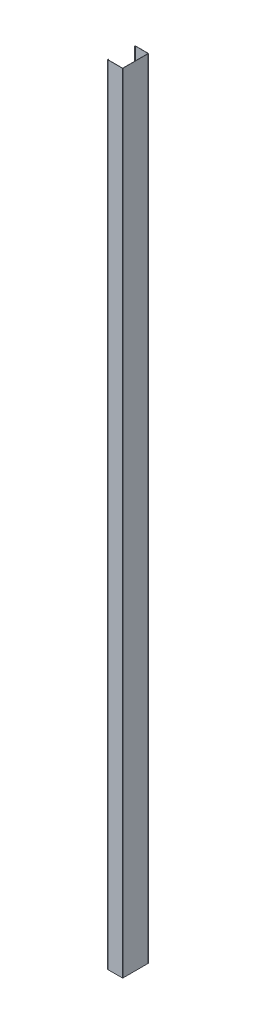
ISO-10303-21;
HEADER;
FILE_DESCRIPTION(('STEP AP214'),'2;1');
FILE_NAME('part.step','',(''),(''),'','','');
FILE_SCHEMA(('AUTOMOTIVE_DESIGN { 1 0 10303 214 1 1 1 1 }'));
ENDSEC;
DATA;
#1=APPLICATION_CONTEXT('core data for automotive mechanical design processes');
#2=APPLICATION_PROTOCOL_DEFINITION('international standard','automotive_design',2000,#1);
#3=PRODUCT_CONTEXT('',#1,'mechanical');
#4=PRODUCT('Part','Part','',(#3));
#5=PRODUCT_RELATED_PRODUCT_CATEGORY('part','',(#4));
#6=PRODUCT_DEFINITION_FORMATION('','',#4);
#7=PRODUCT_DEFINITION_CONTEXT('part definition',#1,'design');
#8=PRODUCT_DEFINITION('design','',#6,#7);
#9=PRODUCT_DEFINITION_SHAPE('','',#8);
#10=(LENGTH_UNIT() NAMED_UNIT(*) SI_UNIT(.MILLI.,.METRE.));
#11=(NAMED_UNIT(*) PLANE_ANGLE_UNIT() SI_UNIT($,.RADIAN.));
#12=(NAMED_UNIT(*) SI_UNIT($,.STERADIAN.) SOLID_ANGLE_UNIT());
#13=UNCERTAINTY_MEASURE_WITH_UNIT(LENGTH_MEASURE(1.E-05),#10,'distance_accuracy_value','');
#14=(GEOMETRIC_REPRESENTATION_CONTEXT(3) GLOBAL_UNCERTAINTY_ASSIGNED_CONTEXT((#13)) GLOBAL_UNIT_ASSIGNED_CONTEXT((#10,
#11,#12)) REPRESENTATION_CONTEXT('',''));
#15=CARTESIAN_POINT('',(0.,0.,0.));
#16=DIRECTION('',(0.,0.,1.));
#17=DIRECTION('',(1.,0.,0.));
#18=AXIS2_PLACEMENT_3D('',#15,#16,#17);
#19=CARTESIAN_POINT('',(-57.8111716302014,3000.,97.));
#20=DIRECTION('',(0.,1.,0.));
#21=DIRECTION('',(0.,0.,1.));
#22=AXIS2_PLACEMENT_3D('',#19,#20,#21);
#23=PLANE('',#22);
#24=DIRECTION('',(1.,0.,0.));
#25=VECTOR('',#24,1.);
#26=CARTESIAN_POINT('',(-57.8111716302014,3000.,97.));
#27=LINE('',#26,#25);
#28=CARTESIAN_POINT('',(-57.8111716302014,3000.,97.));
#29=VERTEX_POINT('',#28);
#30=CARTESIAN_POINT('',(-57.0611716302014,3000.,97.));
#31=VERTEX_POINT('',#30);
#32=EDGE_CURVE('E11',#29,#31,#27,.T.);
#33=ORIENTED_EDGE('',*,*,#32,.F.);
#34=CARTESIAN_POINT('',(-56.3111716302014,3000.,97.));
#35=DIRECTION('',(0.,-1.,0.));
#36=DIRECTION('',(0.,0.,-1.));
#37=AXIS2_PLACEMENT_3D('',#34,#35,#36);
#38=CIRCLE('',#37,1.5);
#39=CARTESIAN_POINT('',(-56.3111716302014,3000.,98.5));
#40=VERTEX_POINT('',#39);
#41=EDGE_CURVE('E362',#29,#40,#38,.F.);
#42=ORIENTED_EDGE('',*,*,#41,.T.);
#43=DIRECTION('',(0.,0.,1.));
#44=VECTOR('',#43,1.);
#45=CARTESIAN_POINT('',(-56.3111716302014,3000.,97.75));
#46=LINE('',#45,#44);
#47=CARTESIAN_POINT('',(-56.3111716302014,3000.,97.75));
#48=VERTEX_POINT('',#47);
#49=EDGE_CURVE('E45',#48,#40,#46,.T.);
#50=ORIENTED_EDGE('',*,*,#49,.F.);
#51=CARTESIAN_POINT('',(-56.3111716302014,3000.,97.));
#52=DIRECTION('',(0.,1.,0.));
#53=DIRECTION('',(1.,0.,0.));
#54=AXIS2_PLACEMENT_3D('',#51,#52,#53);
#55=CIRCLE('',#54,0.75);
#56=EDGE_CURVE('E437',#31,#48,#55,.T.);
#57=ORIENTED_EDGE('',*,*,#56,.F.);
#58=EDGE_LOOP('',(#33,#42,#50,#57));
#59=FACE_BOUND('',#58,.T.);
#60=ADVANCED_FACE('F37',(#59),#23,.T.);
#61=CARTESIAN_POINT('',(-56.3111716302014,3000.,97.75));
#62=DIRECTION('',(0.,1.,0.));
#63=DIRECTION('',(0.,0.,1.));
#64=AXIS2_PLACEMENT_3D('',#61,#62,#63);
#65=PLANE('',#64);
#66=DIRECTION('',(0.,0.,1.));
#67=VECTOR('',#66,1.);
#68=CARTESIAN_POINT('',(-57.8111716302014,3000.,98.5));
#69=LINE('',#68,#67);
#70=CARTESIAN_POINT('',(-57.8111716302014,3000.,95.5));
#71=VERTEX_POINT('',#70);
#72=EDGE_CURVE('E366',#71,#29,#69,.T.);
#73=ORIENTED_EDGE('',*,*,#72,.T.);
#74=ORIENTED_EDGE('',*,*,#32,.T.);
#75=DIRECTION('',(0.,0.,-1.));
#76=VECTOR('',#75,1.);
#77=CARTESIAN_POINT('',(-57.0611716302014,3000.,98.5));
#78=LINE('',#77,#76);
#79=CARTESIAN_POINT('',(-57.0611716302014,3000.,95.5));
#80=VERTEX_POINT('',#79);
#81=EDGE_CURVE('E439',#80,#31,#78,.F.);
#82=ORIENTED_EDGE('',*,*,#81,.F.);
#83=DIRECTION('',(1.,0.,0.));
#84=VECTOR('',#83,1.);
#85=CARTESIAN_POINT('',(-57.8111716302014,3000.,95.5));
#86=LINE('',#85,#84);
#87=EDGE_CURVE('E442',#71,#80,#86,.T.);
#88=ORIENTED_EDGE('',*,*,#87,.F.);
#89=EDGE_LOOP('',(#73,#74,#82,#88));
#90=FACE_BOUND('',#89,.T.);
#91=ADVANCED_FACE('F448',(#90),#65,.T.);
#92=CARTESIAN_POINT('',(-56.3111716302014,0.,98.5));
#93=DIRECTION('',(0.,-1.,0.));
#94=DIRECTION('',(0.,0.,-1.));
#95=AXIS2_PLACEMENT_3D('',#92,#93,#94);
#96=PLANE('',#95);
#97=DIRECTION('',(0.,0.,-1.));
#98=VECTOR('',#97,1.);
#99=CARTESIAN_POINT('',(-56.3111716302014,0.,98.5));
#100=LINE('',#99,#98);
#101=CARTESIAN_POINT('',(-56.3111716302014,0.,98.5));
#102=VERTEX_POINT('',#101);
#103=CARTESIAN_POINT('',(-56.3111716302014,0.,97.75));
#104=VERTEX_POINT('',#103);
#105=EDGE_CURVE('E346',#102,#104,#100,.T.);
#106=ORIENTED_EDGE('',*,*,#105,.F.);
#107=CARTESIAN_POINT('',(-56.3111716302014,0.,97.));
#108=DIRECTION('',(0.,-1.,0.));
#109=DIRECTION('',(0.,0.,-1.));
#110=AXIS2_PLACEMENT_3D('',#107,#108,#109);
#111=CIRCLE('',#110,1.5);
#112=CARTESIAN_POINT('',(-57.8111716302014,0.,97.));
#113=VERTEX_POINT('',#112);
#114=EDGE_CURVE('E262',#113,#102,#111,.F.);
#115=ORIENTED_EDGE('',*,*,#114,.F.);
#116=DIRECTION('',(-1.,0.,0.));
#117=VECTOR('',#116,1.);
#118=CARTESIAN_POINT('',(-57.0611716302014,0.,97.));
#119=LINE('',#118,#117);
#120=CARTESIAN_POINT('',(-57.0611716302014,0.,97.));
#121=VERTEX_POINT('',#120);
#122=EDGE_CURVE('E344',#121,#113,#119,.T.);
#123=ORIENTED_EDGE('',*,*,#122,.F.);
#124=CARTESIAN_POINT('',(-56.3111716302014,0.,97.));
#125=DIRECTION('',(0.,1.,0.));
#126=DIRECTION('',(1.,0.,0.));
#127=AXIS2_PLACEMENT_3D('',#124,#125,#126);
#128=CIRCLE('',#127,0.75);
#129=EDGE_CURVE('E250',#121,#104,#128,.T.);
#130=ORIENTED_EDGE('',*,*,#129,.T.);
#131=EDGE_LOOP('',(#106,#115,#123,#130));
#132=FACE_BOUND('',#131,.T.);
#133=ADVANCED_FACE('F455',(#132),#96,.T.);
#134=CARTESIAN_POINT('',(-57.0611716302014,0.,97.));
#135=DIRECTION('',(0.,-1.,0.));
#136=DIRECTION('',(0.,0.,-1.));
#137=AXIS2_PLACEMENT_3D('',#134,#135,#136);
#138=PLANE('',#137);
#139=DIRECTION('',(1.,0.,0.));
#140=VECTOR('',#139,1.);
#141=CARTESIAN_POINT('',(0.,0.,98.5));
#142=LINE('',#141,#140);
#143=CARTESIAN_POINT('',(-1.49999999999999,0.,98.5));
#144=VERTEX_POINT('',#143);
#145=EDGE_CURVE('E265',#102,#144,#142,.T.);
#146=ORIENTED_EDGE('',*,*,#145,.F.);
#147=ORIENTED_EDGE('',*,*,#105,.T.);
#148=DIRECTION('',(1.,0.,0.));
#149=VECTOR('',#148,1.);
#150=CARTESIAN_POINT('',(0.,0.,97.75));
#151=LINE('',#150,#149);
#152=CARTESIAN_POINT('',(-1.49999999999999,0.,97.75));
#153=VERTEX_POINT('',#152);
#154=EDGE_CURVE('E247',#104,#153,#151,.T.);
#155=ORIENTED_EDGE('',*,*,#154,.T.);
#156=DIRECTION('',(0.,0.,1.));
#157=VECTOR('',#156,1.);
#158=CARTESIAN_POINT('',(-1.49999999999999,0.,97.75));
#159=LINE('',#158,#157);
#160=EDGE_CURVE('E336',#153,#144,#159,.T.);
#161=ORIENTED_EDGE('',*,*,#160,.T.);
#162=EDGE_LOOP('',(#146,#147,#155,#161));
#163=FACE_BOUND('',#162,.T.);
#164=ADVANCED_FACE('F458',(#163),#138,.T.);
#165=CARTESIAN_POINT('',(-1.49999999999999,3000.,98.5));
#166=DIRECTION('',(0.,1.,0.));
#167=DIRECTION('',(0.,0.,1.));
#168=AXIS2_PLACEMENT_3D('',#165,#166,#167);
#169=PLANE('',#168);
#170=DIRECTION('',(0.,0.,-1.));
#171=VECTOR('',#170,1.);
#172=CARTESIAN_POINT('',(-1.49999999999999,3000.,98.5));
#173=LINE('',#172,#171);
#174=CARTESIAN_POINT('',(-1.49999999999999,3000.,98.5));
#175=VERTEX_POINT('',#174);
#176=CARTESIAN_POINT('',(-1.49999999999999,3000.,97.75));
#177=VERTEX_POINT('',#176);
#178=EDGE_CURVE('E342',#175,#177,#173,.T.);
#179=ORIENTED_EDGE('',*,*,#178,.F.);
#180=CARTESIAN_POINT('',(-1.49999999999999,3000.,97.));
#181=DIRECTION('',(0.,-1.,0.));
#182=DIRECTION('',(0.,0.,-1.));
#183=AXIS2_PLACEMENT_3D('',#180,#181,#182);
#184=CIRCLE('',#183,1.5);
#185=CARTESIAN_POINT('',(0.,3000.,97.));
#186=VERTEX_POINT('',#185);
#187=EDGE_CURVE('E374',#175,#186,#184,.F.);
#188=ORIENTED_EDGE('',*,*,#187,.T.);
#189=DIRECTION('',(1.,0.,0.));
#190=VECTOR('',#189,1.);
#191=CARTESIAN_POINT('',(-0.749999999999988,3000.,97.));
#192=LINE('',#191,#190);
#193=CARTESIAN_POINT('',(-0.749999999999988,3000.,97.));
#194=VERTEX_POINT('',#193);
#195=EDGE_CURVE('E340',#194,#186,#192,.T.);
#196=ORIENTED_EDGE('',*,*,#195,.F.);
#197=CARTESIAN_POINT('',(-1.49999999999999,3000.,97.));
#198=DIRECTION('',(0.,1.,0.));
#199=DIRECTION('',(1.,0.,0.));
#200=AXIS2_PLACEMENT_3D('',#197,#198,#199);
#201=CIRCLE('',#200,0.75);
#202=EDGE_CURVE('E433',#177,#194,#201,.T.);
#203=ORIENTED_EDGE('',*,*,#202,.F.);
#204=EDGE_LOOP('',(#179,#188,#196,#203));
#205=FACE_BOUND('',#204,.T.);
#206=ADVANCED_FACE('F478',(#205),#169,.T.);
#207=CARTESIAN_POINT('',(-0.749999999999988,3000.,97.));
#208=DIRECTION('',(0.,1.,0.));
#209=DIRECTION('',(0.,0.,1.));
#210=AXIS2_PLACEMENT_3D('',#207,#208,#209);
#211=PLANE('',#210);
#212=DIRECTION('',(1.,0.,0.));
#213=VECTOR('',#212,1.);
#214=CARTESIAN_POINT('',(0.,3000.,98.5));
#215=LINE('',#214,#213);
#216=EDGE_CURVE('E353',#40,#175,#215,.T.);
#217=ORIENTED_EDGE('',*,*,#216,.T.);
#218=ORIENTED_EDGE('',*,*,#178,.T.);
#219=DIRECTION('',(1.,0.,0.));
#220=VECTOR('',#219,1.);
#221=CARTESIAN_POINT('',(0.,3000.,97.75));
#222=LINE('',#221,#220);
#223=EDGE_CURVE('E356',#48,#177,#222,.T.);
#224=ORIENTED_EDGE('',*,*,#223,.F.);
#225=ORIENTED_EDGE('',*,*,#49,.T.);
#226=EDGE_LOOP('',(#217,#218,#224,#225));
#227=FACE_BOUND('',#226,.T.);
#228=ADVANCED_FACE('F351',(#227),#211,.T.);
#229=CARTESIAN_POINT('',(0.,0.,97.));
#230=DIRECTION('',(0.,-1.,0.));
#231=DIRECTION('',(0.,0.,-1.));
#232=AXIS2_PLACEMENT_3D('',#229,#230,#231);
#233=PLANE('',#232);
#234=DIRECTION('',(-1.,0.,0.));
#235=VECTOR('',#234,1.);
#236=CARTESIAN_POINT('',(0.,0.,97.));
#237=LINE('',#236,#235);
#238=CARTESIAN_POINT('',(0.,0.,97.));
#239=VERTEX_POINT('',#238);
#240=CARTESIAN_POINT('',(-0.749999999999988,0.,97.));
#241=VERTEX_POINT('',#240);
#242=EDGE_CURVE('E338',#239,#241,#237,.T.);
#243=ORIENTED_EDGE('',*,*,#242,.F.);
#244=CARTESIAN_POINT('',(-1.49999999999999,0.,97.));
#245=DIRECTION('',(0.,-1.,0.));
#246=DIRECTION('',(0.,0.,-1.));
#247=AXIS2_PLACEMENT_3D('',#244,#245,#246);
#248=CIRCLE('',#247,1.5);
#249=EDGE_CURVE('E268',#144,#239,#248,.F.);
#250=ORIENTED_EDGE('',*,*,#249,.F.);
#251=ORIENTED_EDGE('',*,*,#160,.F.);
#252=CARTESIAN_POINT('',(-1.49999999999999,0.,97.));
#253=DIRECTION('',(0.,1.,0.));
#254=DIRECTION('',(1.,0.,0.));
#255=AXIS2_PLACEMENT_3D('',#252,#253,#254);
#256=CIRCLE('',#255,0.75);
#257=EDGE_CURVE('E244',#153,#241,#256,.T.);
#258=ORIENTED_EDGE('',*,*,#257,.T.);
#259=EDGE_LOOP('',(#243,#250,#251,#258));
#260=FACE_BOUND('',#259,.T.);
#261=ADVANCED_FACE('F472',(#260),#233,.T.);
#262=CARTESIAN_POINT('',(-1.49999999999999,0.,97.75));
#263=DIRECTION('',(0.,-1.,0.));
#264=DIRECTION('',(0.,0.,-1.));
#265=AXIS2_PLACEMENT_3D('',#262,#263,#264);
#266=PLANE('',#265);
#267=DIRECTION('',(0.,0.,-1.));
#268=VECTOR('',#267,1.);
#269=CARTESIAN_POINT('',(0.,0.,0.));
#270=LINE('',#269,#268);
#271=CARTESIAN_POINT('',(0.,0.,1.5));
#272=VERTEX_POINT('',#271);
#273=EDGE_CURVE('E271',#239,#272,#270,.T.);
#274=ORIENTED_EDGE('',*,*,#273,.F.);
#275=ORIENTED_EDGE('',*,*,#242,.T.);
#276=DIRECTION('',(0.,0.,-1.));
#277=VECTOR('',#276,1.);
#278=CARTESIAN_POINT('',(-0.75,0.,0.));
#279=LINE('',#278,#277);
#280=CARTESIAN_POINT('',(-0.75,0.,1.5));
#281=VERTEX_POINT('',#280);
#282=EDGE_CURVE('E241',#241,#281,#279,.T.);
#283=ORIENTED_EDGE('',*,*,#282,.T.);
#284=DIRECTION('',(1.,0.,0.));
#285=VECTOR('',#284,1.);
#286=CARTESIAN_POINT('',(-0.75,0.,1.5));
#287=LINE('',#286,#285);
#288=EDGE_CURVE('E332',#281,#272,#287,.T.);
#289=ORIENTED_EDGE('',*,*,#288,.T.);
#290=EDGE_LOOP('',(#274,#275,#283,#289));
#291=FACE_BOUND('',#290,.T.);
#292=ADVANCED_FACE('F482',(#291),#266,.T.);
#293=CARTESIAN_POINT('',(0.,3000.,1.5));
#294=DIRECTION('',(0.,1.,0.));
#295=DIRECTION('',(0.,0.,1.));
#296=AXIS2_PLACEMENT_3D('',#293,#294,#295);
#297=PLANE('',#296);
#298=DIRECTION('',(-1.,0.,0.));
#299=VECTOR('',#298,1.);
#300=CARTESIAN_POINT('',(0.,3000.,1.5));
#301=LINE('',#300,#299);
#302=CARTESIAN_POINT('',(0.,3000.,1.5));
#303=VERTEX_POINT('',#302);
#304=CARTESIAN_POINT('',(-0.75,3000.,1.5));
#305=VERTEX_POINT('',#304);
#306=EDGE_CURVE('E194',#303,#305,#301,.T.);
#307=ORIENTED_EDGE('',*,*,#306,.F.);
#308=CARTESIAN_POINT('',(-1.5,3000.,1.5));
#309=DIRECTION('',(0.,-1.,0.));
#310=DIRECTION('',(0.,0.,-1.));
#311=AXIS2_PLACEMENT_3D('',#308,#309,#310);
#312=CIRCLE('',#311,1.5);
#313=CARTESIAN_POINT('',(-1.5,3000.,0.));
#314=VERTEX_POINT('',#313);
#315=EDGE_CURVE('E198',#303,#314,#312,.F.);
#316=ORIENTED_EDGE('',*,*,#315,.T.);
#317=DIRECTION('',(0.,0.,-1.));
#318=VECTOR('',#317,1.);
#319=CARTESIAN_POINT('',(-1.5,3000.,0.75));
#320=LINE('',#319,#318);
#321=CARTESIAN_POINT('',(-1.5,3000.,0.75));
#322=VERTEX_POINT('',#321);
#323=EDGE_CURVE('E182',#322,#314,#320,.T.);
#324=ORIENTED_EDGE('',*,*,#323,.F.);
#325=CARTESIAN_POINT('',(-1.5,3000.,1.5));
#326=DIRECTION('',(0.,1.,0.));
#327=DIRECTION('',(1.,0.,0.));
#328=AXIS2_PLACEMENT_3D('',#325,#326,#327);
#329=CIRCLE('',#328,0.75);
#330=EDGE_CURVE('E395',#305,#322,#329,.T.);
#331=ORIENTED_EDGE('',*,*,#330,.F.);
#332=EDGE_LOOP('',(#307,#316,#324,#331));
#333=FACE_BOUND('',#332,.T.);
#334=ADVANCED_FACE('F200',(#333),#297,.T.);
#335=CARTESIAN_POINT('',(-1.5,3000.,0.75));
#336=DIRECTION('',(0.,1.,0.));
#337=DIRECTION('',(0.,0.,1.));
#338=AXIS2_PLACEMENT_3D('',#335,#336,#337);
#339=PLANE('',#338);
#340=DIRECTION('',(0.,0.,-1.));
#341=VECTOR('',#340,1.);
#342=CARTESIAN_POINT('',(0.,3000.,0.));
#343=LINE('',#342,#341);
#344=EDGE_CURVE('E204',#186,#303,#343,.T.);
#345=ORIENTED_EDGE('',*,*,#344,.T.);
#346=ORIENTED_EDGE('',*,*,#306,.T.);
#347=DIRECTION('',(0.,0.,-1.));
#348=VECTOR('',#347,1.);
#349=CARTESIAN_POINT('',(-0.75,3000.,0.));
#350=LINE('',#349,#348);
#351=EDGE_CURVE('E430',#194,#305,#350,.T.);
#352=ORIENTED_EDGE('',*,*,#351,.F.);
#353=ORIENTED_EDGE('',*,*,#195,.T.);
#354=EDGE_LOOP('',(#345,#346,#352,#353));
#355=FACE_BOUND('',#354,.T.);
#356=ADVANCED_FACE('F382',(#355),#339,.T.);
#357=CARTESIAN_POINT('',(-1.5,0.,0.));
#358=DIRECTION('',(0.,-1.,0.));
#359=DIRECTION('',(0.,0.,-1.));
#360=AXIS2_PLACEMENT_3D('',#357,#358,#359);
#361=PLANE('',#360);
#362=DIRECTION('',(0.,0.,1.));
#363=VECTOR('',#362,1.);
#364=CARTESIAN_POINT('',(-1.5,0.,0.));
#365=LINE('',#364,#363);
#366=CARTESIAN_POINT('',(-1.5,0.,0.));
#367=VERTEX_POINT('',#366);
#368=CARTESIAN_POINT('',(-1.5,0.,0.75));
#369=VERTEX_POINT('',#368);
#370=EDGE_CURVE('E195',#367,#369,#365,.T.);
#371=ORIENTED_EDGE('',*,*,#370,.F.);
#372=CARTESIAN_POINT('',(-1.5,0.,1.5));
#373=DIRECTION('',(0.,-1.,0.));
#374=DIRECTION('',(0.,0.,-1.));
#375=AXIS2_PLACEMENT_3D('',#372,#373,#374);
#376=CIRCLE('',#375,1.5);
#377=EDGE_CURVE('E211',#272,#367,#376,.F.);
#378=ORIENTED_EDGE('',*,*,#377,.F.);
#379=ORIENTED_EDGE('',*,*,#288,.F.);
#380=CARTESIAN_POINT('',(-1.5,0.,1.5));
#381=DIRECTION('',(0.,1.,0.));
#382=DIRECTION('',(1.,0.,0.));
#383=AXIS2_PLACEMENT_3D('',#380,#381,#382);
#384=CIRCLE('',#383,0.75);
#385=EDGE_CURVE('E238',#281,#369,#384,.T.);
#386=ORIENTED_EDGE('',*,*,#385,.T.);
#387=EDGE_LOOP('',(#371,#378,#379,#386));
#388=FACE_BOUND('',#387,.T.);
#389=ADVANCED_FACE('F389',(#388),#361,.T.);
#390=CARTESIAN_POINT('',(-0.75,0.,1.5));
#391=DIRECTION('',(0.,-1.,0.));
#392=DIRECTION('',(0.,0.,-1.));
#393=AXIS2_PLACEMENT_3D('',#390,#391,#392);
#394=PLANE('',#393);
#395=DIRECTION('',(-1.,0.,0.));
#396=VECTOR('',#395,1.);
#397=CARTESIAN_POINT('',(-50.,0.,0.));
#398=LINE('',#397,#396);
#399=CARTESIAN_POINT('',(-48.5,0.,0.));
#400=VERTEX_POINT('',#399);
#401=EDGE_CURVE('E275',#367,#400,#398,.T.);
#402=ORIENTED_EDGE('',*,*,#401,.F.);
#403=ORIENTED_EDGE('',*,*,#370,.T.);
#404=DIRECTION('',(1.,0.,0.));
#405=VECTOR('',#404,1.);
#406=CARTESIAN_POINT('',(-50.,0.,0.75));
#407=LINE('',#406,#405);
#408=CARTESIAN_POINT('',(-48.5,0.,0.75));
#409=VERTEX_POINT('',#408);
#410=EDGE_CURVE('E236',#369,#409,#407,.F.);
#411=ORIENTED_EDGE('',*,*,#410,.T.);
#412=DIRECTION('',(0.,0.,-1.));
#413=VECTOR('',#412,1.);
#414=CARTESIAN_POINT('',(-48.5,0.,0.75));
#415=LINE('',#414,#413);
#416=EDGE_CURVE('E118',#409,#400,#415,.T.);
#417=ORIENTED_EDGE('',*,*,#416,.T.);
#418=EDGE_LOOP('',(#402,#403,#411,#417));
#419=FACE_BOUND('',#418,.T.);
#420=ADVANCED_FACE('F391',(#419),#394,.T.);
#421=CARTESIAN_POINT('',(-48.5,3000.,0.));
#422=DIRECTION('',(0.,1.,0.));
#423=DIRECTION('',(0.,0.,1.));
#424=AXIS2_PLACEMENT_3D('',#421,#422,#423);
#425=PLANE('',#424);
#426=DIRECTION('',(0.,0.,1.));
#427=VECTOR('',#426,1.);
#428=CARTESIAN_POINT('',(-48.5,3000.,0.));
#429=LINE('',#428,#427);
#430=CARTESIAN_POINT('',(-48.5,3000.,0.));
#431=VERTEX_POINT('',#430);
#432=CARTESIAN_POINT('',(-48.5,3000.,0.75));
#433=VERTEX_POINT('',#432);
#434=EDGE_CURVE('E330',#431,#433,#429,.T.);
#435=ORIENTED_EDGE('',*,*,#434,.F.);
#436=CARTESIAN_POINT('',(-48.5,3000.,1.5));
#437=DIRECTION('',(0.,-1.,0.));
#438=DIRECTION('',(0.,0.,-1.));
#439=AXIS2_PLACEMENT_3D('',#436,#437,#438);
#440=CIRCLE('',#439,1.5);
#441=CARTESIAN_POINT('',(-50.,3000.,1.5));
#442=VERTEX_POINT('',#441);
#443=EDGE_CURVE('E219',#431,#442,#440,.F.);
#444=ORIENTED_EDGE('',*,*,#443,.T.);
#445=DIRECTION('',(-1.,0.,0.));
#446=VECTOR('',#445,1.);
#447=CARTESIAN_POINT('',(-49.25,3000.,1.5));
#448=LINE('',#447,#446);
#449=CARTESIAN_POINT('',(-49.25,3000.,1.5));
#450=VERTEX_POINT('',#449);
#451=EDGE_CURVE('E53',#450,#442,#448,.T.);
#452=ORIENTED_EDGE('',*,*,#451,.F.);
#453=CARTESIAN_POINT('',(-48.5,3000.,1.5));
#454=DIRECTION('',(0.,1.,0.));
#455=DIRECTION('',(1.,0.,0.));
#456=AXIS2_PLACEMENT_3D('',#453,#454,#455);
#457=CIRCLE('',#456,0.75);
#458=EDGE_CURVE('E423',#433,#450,#457,.T.);
#459=ORIENTED_EDGE('',*,*,#458,.F.);
#460=EDGE_LOOP('',(#435,#444,#452,#459));
#461=FACE_BOUND('',#460,.T.);
#462=ADVANCED_FACE('F553',(#461),#425,.T.);
#463=CARTESIAN_POINT('',(-49.25,3000.,1.5));
#464=DIRECTION('',(0.,1.,0.));
#465=DIRECTION('',(0.,0.,1.));
#466=AXIS2_PLACEMENT_3D('',#463,#464,#465);
#467=PLANE('',#466);
#468=DIRECTION('',(-1.,0.,0.));
#469=VECTOR('',#468,1.);
#470=CARTESIAN_POINT('',(-50.,3000.,0.));
#471=LINE('',#470,#469);
#472=EDGE_CURVE('E186',#314,#431,#471,.T.);
#473=ORIENTED_EDGE('',*,*,#472,.T.);
#474=ORIENTED_EDGE('',*,*,#434,.T.);
#475=DIRECTION('',(1.,0.,0.));
#476=VECTOR('',#475,1.);
#477=CARTESIAN_POINT('',(-50.,3000.,0.75));
#478=LINE('',#477,#476);
#479=EDGE_CURVE('E189',#322,#433,#478,.F.);
#480=ORIENTED_EDGE('',*,*,#479,.F.);
#481=ORIENTED_EDGE('',*,*,#323,.T.);
#482=EDGE_LOOP('',(#473,#474,#480,#481));
#483=FACE_BOUND('',#482,.T.);
#484=ADVANCED_FACE('F184',(#483),#467,.T.);
#485=CARTESIAN_POINT('',(-50.,0.,1.5));
#486=DIRECTION('',(0.,-1.,0.));
#487=DIRECTION('',(0.,0.,-1.));
#488=AXIS2_PLACEMENT_3D('',#485,#486,#487);
#489=PLANE('',#488);
#490=DIRECTION('',(1.,0.,0.));
#491=VECTOR('',#490,1.);
#492=CARTESIAN_POINT('',(-50.,0.,1.5));
#493=LINE('',#492,#491);
#494=CARTESIAN_POINT('',(-50.,0.,1.5));
#495=VERTEX_POINT('',#494);
#496=CARTESIAN_POINT('',(-49.25,0.,1.5));
#497=VERTEX_POINT('',#496);
#498=EDGE_CURVE('E125',#495,#497,#493,.T.);
#499=ORIENTED_EDGE('',*,*,#498,.F.);
#500=CARTESIAN_POINT('',(-48.5,0.,1.5));
#501=DIRECTION('',(0.,-1.,0.));
#502=DIRECTION('',(0.,0.,-1.));
#503=AXIS2_PLACEMENT_3D('',#500,#501,#502);
#504=CIRCLE('',#503,1.5);
#505=EDGE_CURVE('E277',#400,#495,#504,.F.);
#506=ORIENTED_EDGE('',*,*,#505,.F.);
#507=ORIENTED_EDGE('',*,*,#416,.F.);
#508=CARTESIAN_POINT('',(-48.5,0.,1.5));
#509=DIRECTION('',(0.,1.,0.));
#510=DIRECTION('',(1.,0.,0.));
#511=AXIS2_PLACEMENT_3D('',#508,#509,#510);
#512=CIRCLE('',#511,0.75);
#513=EDGE_CURVE('E234',#409,#497,#512,.T.);
#514=ORIENTED_EDGE('',*,*,#513,.T.);
#515=EDGE_LOOP('',(#499,#506,#507,#514));
#516=FACE_BOUND('',#515,.T.);
#517=ADVANCED_FACE('F406',(#516),#489,.T.);
#518=CARTESIAN_POINT('',(-48.5,0.,0.75));
#519=DIRECTION('',(0.,-1.,0.));
#520=DIRECTION('',(0.,0.,-1.));
#521=AXIS2_PLACEMENT_3D('',#518,#519,#520);
#522=PLANE('',#521);
#523=DIRECTION('',(0.,0.,1.));
#524=VECTOR('',#523,1.);
#525=CARTESIAN_POINT('',(-50.,0.,0.));
#526=LINE('',#525,#524);
#527=CARTESIAN_POINT('',(-50.,0.,3.));
#528=VERTEX_POINT('',#527);
#529=EDGE_CURVE('E225',#495,#528,#526,.T.);
#530=ORIENTED_EDGE('',*,*,#529,.F.);
#531=ORIENTED_EDGE('',*,*,#498,.T.);
#532=DIRECTION('',(0.,0.,-1.));
#533=VECTOR('',#532,1.);
#534=CARTESIAN_POINT('',(-49.25,0.,0.));
#535=LINE('',#534,#533);
#536=CARTESIAN_POINT('',(-49.25,0.,3.));
#537=VERTEX_POINT('',#536);
#538=EDGE_CURVE('E231',#497,#537,#535,.F.);
#539=ORIENTED_EDGE('',*,*,#538,.T.);
#540=DIRECTION('',(-1.,0.,0.));
#541=VECTOR('',#540,1.);
#542=CARTESIAN_POINT('',(-49.25,0.,3.));
#543=LINE('',#542,#541);
#544=EDGE_CURVE('E228',#537,#528,#543,.T.);
#545=ORIENTED_EDGE('',*,*,#544,.T.);
#546=EDGE_LOOP('',(#530,#531,#539,#545));
#547=FACE_BOUND('',#546,.T.);
#548=ADVANCED_FACE('F414',(#547),#522,.T.);
#549=CARTESIAN_POINT('',(-50.,3000.,0.));
#550=DIRECTION('',(1.,0.,0.));
#551=DIRECTION('',(0.,0.,-1.));
#552=AXIS2_PLACEMENT_3D('',#549,#550,#551);
#553=PLANE('',#552);
#554=ORIENTED_EDGE('',*,*,#529,.T.);
#555=DIRECTION('',(0.,-1.,0.));
#556=VECTOR('',#555,1.);
#557=CARTESIAN_POINT('',(-50.,3000.,3.));
#558=LINE('',#557,#556);
#559=CARTESIAN_POINT('',(-50.,3000.,3.));
#560=VERTEX_POINT('',#559);
#561=EDGE_CURVE('E325',#560,#528,#558,.T.);
#562=ORIENTED_EDGE('',*,*,#561,.F.);
#563=DIRECTION('',(0.,0.,1.));
#564=VECTOR('',#563,1.);
#565=CARTESIAN_POINT('',(-50.,3000.,0.));
#566=LINE('',#565,#564);
#567=EDGE_CURVE('E131',#442,#560,#566,.T.);
#568=ORIENTED_EDGE('',*,*,#567,.F.);
#569=DIRECTION('',(0.,-1.,0.));
#570=VECTOR('',#569,1.);
#571=CARTESIAN_POINT('',(-50.,3000.,1.5));
#572=LINE('',#571,#570);
#573=EDGE_CURVE('E221',#442,#495,#572,.T.);
#574=ORIENTED_EDGE('',*,*,#573,.T.);
#575=EDGE_LOOP('',(#554,#562,#568,#574));
#576=FACE_BOUND('',#575,.T.);
#577=ADVANCED_FACE('F412',(#576),#553,.F.);
#578=CARTESIAN_POINT('',(-49.25,3000.,3.));
#579=DIRECTION('',(0.,0.,1.));
#580=DIRECTION('',(1.,0.,0.));
#581=AXIS2_PLACEMENT_3D('',#578,#579,#580);
#582=PLANE('',#581);
#583=ORIENTED_EDGE('',*,*,#544,.F.);
#584=DIRECTION('',(0.,-1.,0.));
#585=VECTOR('',#584,1.);
#586=CARTESIAN_POINT('',(-49.25,3000.,3.));
#587=LINE('',#586,#585);
#588=CARTESIAN_POINT('',(-49.25,3000.,3.));
#589=VERTEX_POINT('',#588);
#590=EDGE_CURVE('E323',#589,#537,#587,.T.);
#591=ORIENTED_EDGE('',*,*,#590,.F.);
#592=DIRECTION('',(-1.,0.,0.));
#593=VECTOR('',#592,1.);
#594=CARTESIAN_POINT('',(-49.25,3000.,3.));
#595=LINE('',#594,#593);
#596=EDGE_CURVE('E419',#589,#560,#595,.T.);
#597=ORIENTED_EDGE('',*,*,#596,.T.);
#598=ORIENTED_EDGE('',*,*,#561,.T.);
#599=EDGE_LOOP('',(#583,#591,#597,#598));
#600=FACE_BOUND('',#599,.T.);
#601=ADVANCED_FACE('F417',(#600),#582,.T.);
#602=CARTESIAN_POINT('',(-49.25,3000.,0.));
#603=DIRECTION('',(1.,0.,0.));
#604=DIRECTION('',(0.,0.,-1.));
#605=AXIS2_PLACEMENT_3D('',#602,#603,#604);
#606=PLANE('',#605);
#607=ORIENTED_EDGE('',*,*,#538,.F.);
#608=DIRECTION('',(0.,-1.,0.));
#609=VECTOR('',#608,1.);
#610=CARTESIAN_POINT('',(-49.25,3000.,1.5));
#611=LINE('',#610,#609);
#612=EDGE_CURVE('E320',#450,#497,#611,.T.);
#613=ORIENTED_EDGE('',*,*,#612,.F.);
#614=DIRECTION('',(0.,0.,-1.));
#615=VECTOR('',#614,1.);
#616=CARTESIAN_POINT('',(-49.25,3000.,0.));
#617=LINE('',#616,#615);
#618=EDGE_CURVE('E421',#450,#589,#617,.F.);
#619=ORIENTED_EDGE('',*,*,#618,.T.);
#620=ORIENTED_EDGE('',*,*,#590,.T.);
#621=EDGE_LOOP('',(#607,#613,#619,#620));
#622=FACE_BOUND('',#621,.T.);
#623=ADVANCED_FACE('F609',(#622),#606,.T.);
#624=CARTESIAN_POINT('',(-48.5,3000.,1.5));
#625=DIRECTION('',(0.,-1.,0.));
#626=DIRECTION('',(0.,0.,-1.));
#627=AXIS2_PLACEMENT_3D('',#624,#625,#626);
#628=CYLINDRICAL_SURFACE('',#627,0.75);
#629=ORIENTED_EDGE('',*,*,#513,.F.);
#630=DIRECTION('',(0.,-1.,0.));
#631=VECTOR('',#630,1.);
#632=CARTESIAN_POINT('',(-48.5,3000.,0.75));
#633=LINE('',#632,#631);
#634=EDGE_CURVE('E317',#433,#409,#633,.T.);
#635=ORIENTED_EDGE('',*,*,#634,.F.);
#636=ORIENTED_EDGE('',*,*,#458,.T.);
#637=ORIENTED_EDGE('',*,*,#612,.T.);
#638=EDGE_LOOP('',(#629,#635,#636,#637));
#639=FACE_BOUND('',#638,.T.);
#640=ADVANCED_FACE('F403',(#639),#628,.F.);
#641=CARTESIAN_POINT('',(-50.,3000.,0.75));
#642=DIRECTION('',(0.,0.,1.));
#643=DIRECTION('',(1.,0.,0.));
#644=AXIS2_PLACEMENT_3D('',#641,#642,#643);
#645=PLANE('',#644);
#646=ORIENTED_EDGE('',*,*,#410,.F.);
#647=DIRECTION('',(0.,-1.,0.));
#648=VECTOR('',#647,1.);
#649=CARTESIAN_POINT('',(-1.5,3000.,0.75));
#650=LINE('',#649,#648);
#651=EDGE_CURVE('E314',#322,#369,#650,.T.);
#652=ORIENTED_EDGE('',*,*,#651,.F.);
#653=ORIENTED_EDGE('',*,*,#479,.T.);
#654=ORIENTED_EDGE('',*,*,#634,.T.);
#655=EDGE_LOOP('',(#646,#652,#653,#654));
#656=FACE_BOUND('',#655,.T.);
#657=ADVANCED_FACE('F397',(#656),#645,.T.);
#658=CARTESIAN_POINT('',(-1.5,3000.,1.5));
#659=DIRECTION('',(0.,-1.,0.));
#660=DIRECTION('',(0.,0.,-1.));
#661=AXIS2_PLACEMENT_3D('',#658,#659,#660);
#662=CYLINDRICAL_SURFACE('',#661,0.75);
#663=ORIENTED_EDGE('',*,*,#385,.F.);
#664=DIRECTION('',(0.,-1.,0.));
#665=VECTOR('',#664,1.);
#666=CARTESIAN_POINT('',(-0.75,3000.,1.5));
#667=LINE('',#666,#665);
#668=EDGE_CURVE('E311',#305,#281,#667,.T.);
#669=ORIENTED_EDGE('',*,*,#668,.F.);
#670=ORIENTED_EDGE('',*,*,#330,.T.);
#671=ORIENTED_EDGE('',*,*,#651,.T.);
#672=EDGE_LOOP('',(#663,#669,#670,#671));
#673=FACE_BOUND('',#672,.T.);
#674=ADVANCED_FACE('F394',(#673),#662,.F.);
#675=CARTESIAN_POINT('',(-0.75,3000.,0.));
#676=DIRECTION('',(-1.,0.,0.));
#677=DIRECTION('',(0.,0.,1.));
#678=AXIS2_PLACEMENT_3D('',#675,#676,#677);
#679=PLANE('',#678);
#680=ORIENTED_EDGE('',*,*,#282,.F.);
#681=DIRECTION('',(0.,-1.,0.));
#682=VECTOR('',#681,1.);
#683=CARTESIAN_POINT('',(-0.749999999999988,3000.,97.));
#684=LINE('',#683,#682);
#685=EDGE_CURVE('E308',#194,#241,#684,.T.);
#686=ORIENTED_EDGE('',*,*,#685,.F.);
#687=ORIENTED_EDGE('',*,*,#351,.T.);
#688=ORIENTED_EDGE('',*,*,#668,.T.);
#689=EDGE_LOOP('',(#680,#686,#687,#688));
#690=FACE_BOUND('',#689,.T.);
#691=ADVANCED_FACE('F480',(#690),#679,.T.);
#692=CARTESIAN_POINT('',(-1.49999999999999,3000.,97.));
#693=DIRECTION('',(0.,-1.,0.));
#694=DIRECTION('',(0.,0.,-1.));
#695=AXIS2_PLACEMENT_3D('',#692,#693,#694);
#696=CYLINDRICAL_SURFACE('',#695,0.75);
#697=ORIENTED_EDGE('',*,*,#257,.F.);
#698=DIRECTION('',(0.,-1.,0.));
#699=VECTOR('',#698,1.);
#700=CARTESIAN_POINT('',(-1.49999999999999,3000.,97.75));
#701=LINE('',#700,#699);
#702=EDGE_CURVE('E305',#177,#153,#701,.T.);
#703=ORIENTED_EDGE('',*,*,#702,.F.);
#704=ORIENTED_EDGE('',*,*,#202,.T.);
#705=ORIENTED_EDGE('',*,*,#685,.T.);
#706=EDGE_LOOP('',(#697,#703,#704,#705));
#707=FACE_BOUND('',#706,.T.);
#708=ADVANCED_FACE('F468',(#707),#696,.F.);
#709=CARTESIAN_POINT('',(0.,3000.,97.75));
#710=DIRECTION('',(0.,0.,-1.));
#711=DIRECTION('',(-1.,0.,0.));
#712=AXIS2_PLACEMENT_3D('',#709,#710,#711);
#713=PLANE('',#712);
#714=ORIENTED_EDGE('',*,*,#154,.F.);
#715=DIRECTION('',(0.,-1.,0.));
#716=VECTOR('',#715,1.);
#717=CARTESIAN_POINT('',(-56.3111716302014,3000.,97.75));
#718=LINE('',#717,#716);
#719=EDGE_CURVE('E302',#48,#104,#718,.T.);
#720=ORIENTED_EDGE('',*,*,#719,.F.);
#721=ORIENTED_EDGE('',*,*,#223,.T.);
#722=ORIENTED_EDGE('',*,*,#702,.T.);
#723=EDGE_LOOP('',(#714,#720,#721,#722));
#724=FACE_BOUND('',#723,.T.);
#725=ADVANCED_FACE('F463',(#724),#713,.T.);
#726=CARTESIAN_POINT('',(-56.3111716302014,3000.,97.));
#727=DIRECTION('',(0.,-1.,0.));
#728=DIRECTION('',(0.,0.,-1.));
#729=AXIS2_PLACEMENT_3D('',#726,#727,#728);
#730=CYLINDRICAL_SURFACE('',#729,0.75);
#731=ORIENTED_EDGE('',*,*,#129,.F.);
#732=DIRECTION('',(0.,-1.,0.));
#733=VECTOR('',#732,1.);
#734=CARTESIAN_POINT('',(-57.0611716302014,3000.,97.));
#735=LINE('',#734,#733);
#736=EDGE_CURVE('E299',#31,#121,#735,.T.);
#737=ORIENTED_EDGE('',*,*,#736,.F.);
#738=ORIENTED_EDGE('',*,*,#56,.T.);
#739=ORIENTED_EDGE('',*,*,#719,.T.);
#740=EDGE_LOOP('',(#731,#737,#738,#739));
#741=FACE_BOUND('',#740,.T.);
#742=ADVANCED_FACE('F461',(#741),#730,.F.);
#743=CARTESIAN_POINT('',(-57.0611716302014,3000.,98.5));
#744=DIRECTION('',(1.,0.,0.));
#745=DIRECTION('',(0.,0.,-1.));
#746=AXIS2_PLACEMENT_3D('',#743,#744,#745);
#747=PLANE('',#746);
#748=DIRECTION('',(0.,0.,-1.));
#749=VECTOR('',#748,1.);
#750=CARTESIAN_POINT('',(-57.0611716302014,0.,98.5));
#751=LINE('',#750,#749);
#752=CARTESIAN_POINT('',(-57.0611716302014,0.,95.5));
#753=VERTEX_POINT('',#752);
#754=EDGE_CURVE('E253',#753,#121,#751,.F.);
#755=ORIENTED_EDGE('',*,*,#754,.F.);
#756=DIRECTION('',(0.,-1.,0.));
#757=VECTOR('',#756,1.);
#758=CARTESIAN_POINT('',(-57.0611716302014,3000.,95.5));
#759=LINE('',#758,#757);
#760=EDGE_CURVE('E297',#80,#753,#759,.T.);
#761=ORIENTED_EDGE('',*,*,#760,.F.);
#762=ORIENTED_EDGE('',*,*,#81,.T.);
#763=ORIENTED_EDGE('',*,*,#736,.T.);
#764=EDGE_LOOP('',(#755,#761,#762,#763));
#765=FACE_BOUND('',#764,.T.);
#766=ADVANCED_FACE('F683',(#765),#747,.T.);
#767=CARTESIAN_POINT('',(-57.8111716302014,3000.,95.5));
#768=DIRECTION('',(0.,0.,-1.));
#769=DIRECTION('',(-1.,0.,0.));
#770=AXIS2_PLACEMENT_3D('',#767,#768,#769);
#771=PLANE('',#770);
#772=DIRECTION('',(1.,0.,0.));
#773=VECTOR('',#772,1.);
#774=CARTESIAN_POINT('',(-57.8111716302014,0.,95.5));
#775=LINE('',#774,#773);
#776=CARTESIAN_POINT('',(-57.8111716302014,0.,95.5));
#777=VERTEX_POINT('',#776);
#778=EDGE_CURVE('E256',#777,#753,#775,.T.);
#779=ORIENTED_EDGE('',*,*,#778,.F.);
#780=DIRECTION('',(0.,-1.,0.));
#781=VECTOR('',#780,1.);
#782=CARTESIAN_POINT('',(-57.8111716302014,3000.,95.5));
#783=LINE('',#782,#781);
#784=EDGE_CURVE('E295',#71,#777,#783,.T.);
#785=ORIENTED_EDGE('',*,*,#784,.F.);
#786=ORIENTED_EDGE('',*,*,#87,.T.);
#787=ORIENTED_EDGE('',*,*,#760,.T.);
#788=EDGE_LOOP('',(#779,#785,#786,#787));
#789=FACE_BOUND('',#788,.T.);
#790=ADVANCED_FACE('F693',(#789),#771,.T.);
#791=CARTESIAN_POINT('',(-57.8111716302014,3000.,98.5));
#792=DIRECTION('',(1.,0.,0.));
#793=DIRECTION('',(0.,0.,-1.));
#794=AXIS2_PLACEMENT_3D('',#791,#792,#793);
#795=PLANE('',#794);
#796=DIRECTION('',(0.,0.,1.));
#797=VECTOR('',#796,1.);
#798=CARTESIAN_POINT('',(-57.8111716302014,0.,98.5));
#799=LINE('',#798,#797);
#800=EDGE_CURVE('E259',#777,#113,#799,.T.);
#801=ORIENTED_EDGE('',*,*,#800,.T.);
#802=DIRECTION('',(0.,-1.,0.));
#803=VECTOR('',#802,1.);
#804=CARTESIAN_POINT('',(-57.8111716302014,3000.,97.));
#805=LINE('',#804,#803);
#806=EDGE_CURVE('E292',#29,#113,#805,.T.);
#807=ORIENTED_EDGE('',*,*,#806,.F.);
#808=ORIENTED_EDGE('',*,*,#72,.F.);
#809=ORIENTED_EDGE('',*,*,#784,.T.);
#810=EDGE_LOOP('',(#801,#807,#808,#809));
#811=FACE_BOUND('',#810,.T.);
#812=ADVANCED_FACE('F452',(#811),#795,.F.);
#813=CARTESIAN_POINT('',(-56.3111716302014,3000.,97.));
#814=DIRECTION('',(0.,-1.,0.));
#815=DIRECTION('',(0.,0.,-1.));
#816=AXIS2_PLACEMENT_3D('',#813,#814,#815);
#817=CYLINDRICAL_SURFACE('',#816,1.5);
#818=ORIENTED_EDGE('',*,*,#114,.T.);
#819=DIRECTION('',(0.,-1.,0.));
#820=VECTOR('',#819,1.);
#821=CARTESIAN_POINT('',(-56.3111716302014,3000.,98.5));
#822=LINE('',#821,#820);
#823=EDGE_CURVE('E289',#40,#102,#822,.T.);
#824=ORIENTED_EDGE('',*,*,#823,.F.);
#825=ORIENTED_EDGE('',*,*,#41,.F.);
#826=ORIENTED_EDGE('',*,*,#806,.T.);
#827=EDGE_LOOP('',(#818,#824,#825,#826));
#828=FACE_BOUND('',#827,.T.);
#829=ADVANCED_FACE('F368',(#828),#817,.T.);
#830=CARTESIAN_POINT('',(0.,3000.,98.5));
#831=DIRECTION('',(0.,0.,-1.));
#832=DIRECTION('',(-1.,0.,0.));
#833=AXIS2_PLACEMENT_3D('',#830,#831,#832);
#834=PLANE('',#833);
#835=ORIENTED_EDGE('',*,*,#145,.T.);
#836=DIRECTION('',(0.,-1.,0.));
#837=VECTOR('',#836,1.);
#838=CARTESIAN_POINT('',(-1.49999999999999,3000.,98.5));
#839=LINE('',#838,#837);
#840=EDGE_CURVE('E286',#175,#144,#839,.T.);
#841=ORIENTED_EDGE('',*,*,#840,.F.);
#842=ORIENTED_EDGE('',*,*,#216,.F.);
#843=ORIENTED_EDGE('',*,*,#823,.T.);
#844=EDGE_LOOP('',(#835,#841,#842,#843));
#845=FACE_BOUND('',#844,.T.);
#846=ADVANCED_FACE('F372',(#845),#834,.F.);
#847=CARTESIAN_POINT('',(-1.49999999999999,3000.,97.));
#848=DIRECTION('',(0.,-1.,0.));
#849=DIRECTION('',(0.,0.,-1.));
#850=AXIS2_PLACEMENT_3D('',#847,#848,#849);
#851=CYLINDRICAL_SURFACE('',#850,1.5);
#852=ORIENTED_EDGE('',*,*,#249,.T.);
#853=DIRECTION('',(0.,-1.,0.));
#854=VECTOR('',#853,1.);
#855=CARTESIAN_POINT('',(0.,3000.,97.));
#856=LINE('',#855,#854);
#857=EDGE_CURVE('E283',#186,#239,#856,.T.);
#858=ORIENTED_EDGE('',*,*,#857,.F.);
#859=ORIENTED_EDGE('',*,*,#187,.F.);
#860=ORIENTED_EDGE('',*,*,#840,.T.);
#861=EDGE_LOOP('',(#852,#858,#859,#860));
#862=FACE_BOUND('',#861,.T.);
#863=ADVANCED_FACE('F475',(#862),#851,.T.);
#864=CARTESIAN_POINT('',(0.,3000.,0.));
#865=DIRECTION('',(-1.,0.,0.));
#866=DIRECTION('',(0.,0.,1.));
#867=AXIS2_PLACEMENT_3D('',#864,#865,#866);
#868=PLANE('',#867);
#869=ORIENTED_EDGE('',*,*,#273,.T.);
#870=DIRECTION('',(0.,-1.,0.));
#871=VECTOR('',#870,1.);
#872=CARTESIAN_POINT('',(0.,3000.,1.5));
#873=LINE('',#872,#871);
#874=EDGE_CURVE('E213',#303,#272,#873,.T.);
#875=ORIENTED_EDGE('',*,*,#874,.F.);
#876=ORIENTED_EDGE('',*,*,#344,.F.);
#877=ORIENTED_EDGE('',*,*,#857,.T.);
#878=EDGE_LOOP('',(#869,#875,#876,#877));
#879=FACE_BOUND('',#878,.T.);
#880=ADVANCED_FACE('F386',(#879),#868,.F.);
#881=CARTESIAN_POINT('',(-1.5,3000.,1.5));
#882=DIRECTION('',(0.,-1.,0.));
#883=DIRECTION('',(0.,0.,-1.));
#884=AXIS2_PLACEMENT_3D('',#881,#882,#883);
#885=CYLINDRICAL_SURFACE('',#884,1.5);
#886=ORIENTED_EDGE('',*,*,#377,.T.);
#887=DIRECTION('',(0.,-1.,0.));
#888=VECTOR('',#887,1.);
#889=CARTESIAN_POINT('',(-1.5,3000.,0.));
#890=LINE('',#889,#888);
#891=EDGE_CURVE('E208',#314,#367,#890,.T.);
#892=ORIENTED_EDGE('',*,*,#891,.F.);
#893=ORIENTED_EDGE('',*,*,#315,.F.);
#894=ORIENTED_EDGE('',*,*,#874,.T.);
#895=EDGE_LOOP('',(#886,#892,#893,#894));
#896=FACE_BOUND('',#895,.T.);
#897=ADVANCED_FACE('F209',(#896),#885,.T.);
#898=CARTESIAN_POINT('',(-50.,3000.,0.));
#899=DIRECTION('',(0.,0.,1.));
#900=DIRECTION('',(1.,0.,0.));
#901=AXIS2_PLACEMENT_3D('',#898,#899,#900);
#902=PLANE('',#901);
#903=ORIENTED_EDGE('',*,*,#401,.T.);
#904=DIRECTION('',(0.,-1.,0.));
#905=VECTOR('',#904,1.);
#906=CARTESIAN_POINT('',(-48.5,3000.,0.));
#907=LINE('',#906,#905);
#908=EDGE_CURVE('E214',#431,#400,#907,.T.);
#909=ORIENTED_EDGE('',*,*,#908,.F.);
#910=ORIENTED_EDGE('',*,*,#472,.F.);
#911=ORIENTED_EDGE('',*,*,#891,.T.);
#912=EDGE_LOOP('',(#903,#909,#910,#911));
#913=FACE_BOUND('',#912,.T.);
#914=ADVANCED_FACE('F216',(#913),#902,.F.);
#915=CARTESIAN_POINT('',(-48.5,3000.,1.5));
#916=DIRECTION('',(0.,-1.,0.));
#917=DIRECTION('',(0.,0.,-1.));
#918=AXIS2_PLACEMENT_3D('',#915,#916,#917);
#919=CYLINDRICAL_SURFACE('',#918,1.5);
#920=ORIENTED_EDGE('',*,*,#505,.T.);
#921=ORIENTED_EDGE('',*,*,#573,.F.);
#922=ORIENTED_EDGE('',*,*,#443,.F.);
#923=ORIENTED_EDGE('',*,*,#908,.T.);
#924=EDGE_LOOP('',(#920,#921,#922,#923));
#925=FACE_BOUND('',#924,.T.);
#926=ADVANCED_FACE('F409',(#925),#919,.T.);
#927=CARTESIAN_POINT('',(-48.5,3000.,1.5));
#928=DIRECTION('',(0.,1.,0.));
#929=DIRECTION('',(1.,0.,0.));
#930=AXIS2_PLACEMENT_3D('',#927,#928,#929);
#931=PLANE('',#930);
#932=ORIENTED_EDGE('',*,*,#567,.T.);
#933=ORIENTED_EDGE('',*,*,#596,.F.);
#934=ORIENTED_EDGE('',*,*,#618,.F.);
#935=ORIENTED_EDGE('',*,*,#451,.T.);
#936=EDGE_LOOP('',(#932,#933,#934,#935));
#937=FACE_BOUND('',#936,.T.);
#938=ADVANCED_FACE('F777',(#937),#931,.T.);
#939=CARTESIAN_POINT('',(-48.5,0.,1.5));
#940=DIRECTION('',(0.,1.,0.));
#941=DIRECTION('',(1.,0.,0.));
#942=AXIS2_PLACEMENT_3D('',#939,#940,#941);
#943=PLANE('',#942);
#944=ORIENTED_EDGE('',*,*,#754,.T.);
#945=ORIENTED_EDGE('',*,*,#122,.T.);
#946=ORIENTED_EDGE('',*,*,#800,.F.);
#947=ORIENTED_EDGE('',*,*,#778,.T.);
#948=EDGE_LOOP('',(#944,#945,#946,#947));
#949=FACE_BOUND('',#948,.T.);
#950=ADVANCED_FACE('F787',(#949),#943,.F.);
#951=CLOSED_SHELL('',(#60,#91,#133,#164,#206,#228,#261,#292,#334,#356,#389,#420,#462,#484,#517,
#548,#577,#601,#623,#640,#657,#674,#691,#708,#725,#742,#766,#790,#812,#829,#846,#863,#880,#897,
#914,#926,#938,#950));
#952=MANIFOLD_SOLID_BREP('B2',#951);
#953=ADVANCED_BREP_SHAPE_REPRESENTATION('',(#18,#952),#14);
#954=SHAPE_DEFINITION_REPRESENTATION(#9,#953);
ENDSEC;
END-ISO-10303-21;
